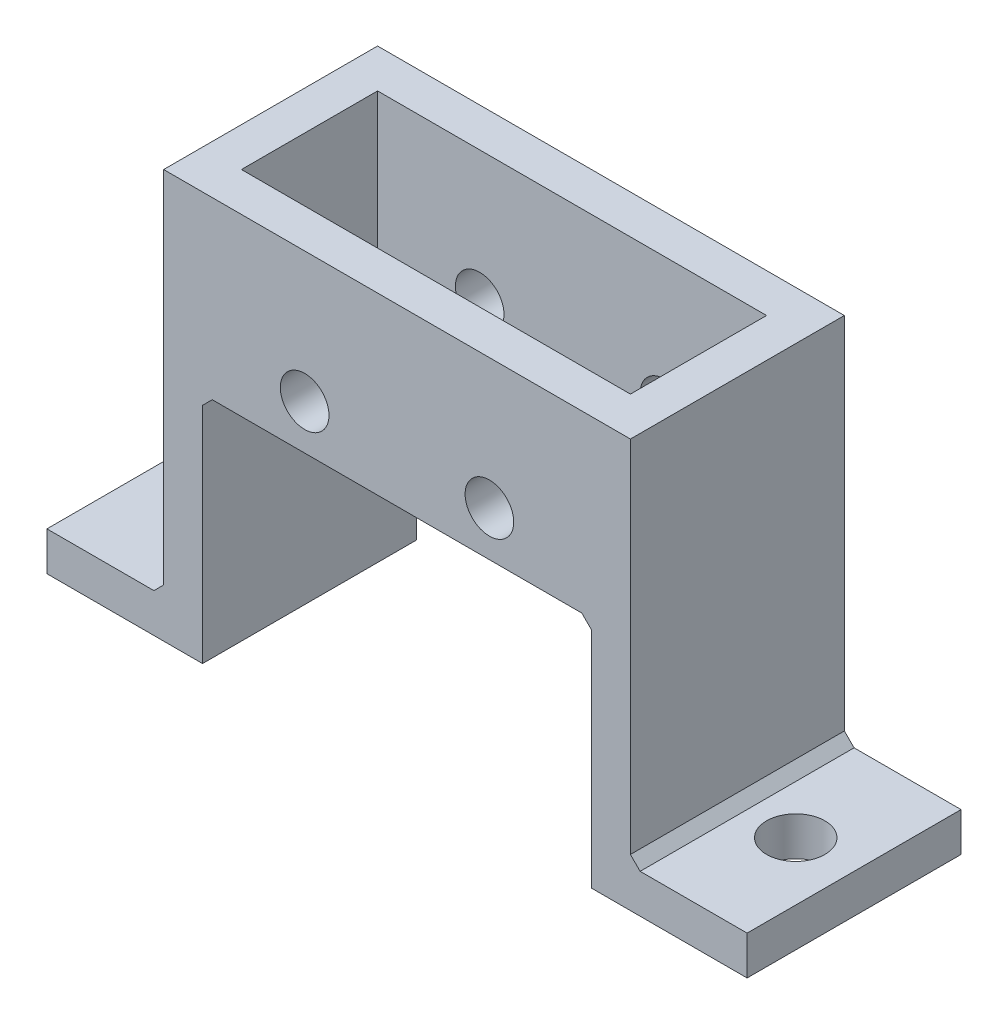
ISO-10303-21;
HEADER;
FILE_DESCRIPTION(('STEP AP214'),'2;1');
FILE_NAME('part.step','',(''),(''),'','','');
FILE_SCHEMA(('AUTOMOTIVE_DESIGN { 1 0 10303 214 1 1 1 1 }'));
ENDSEC;
DATA;
#1=APPLICATION_CONTEXT('core data for automotive mechanical design processes');
#2=APPLICATION_PROTOCOL_DEFINITION('international standard','automotive_design',2000,#1);
#3=PRODUCT_CONTEXT('',#1,'mechanical');
#4=PRODUCT('Part','Part','',(#3));
#5=PRODUCT_RELATED_PRODUCT_CATEGORY('part','',(#4));
#6=PRODUCT_DEFINITION_FORMATION('','',#4);
#7=PRODUCT_DEFINITION_CONTEXT('part definition',#1,'design');
#8=PRODUCT_DEFINITION('design','',#6,#7);
#9=PRODUCT_DEFINITION_SHAPE('','',#8);
#10=(LENGTH_UNIT() NAMED_UNIT(*) SI_UNIT(.MILLI.,.METRE.));
#11=(NAMED_UNIT(*) PLANE_ANGLE_UNIT() SI_UNIT($,.RADIAN.));
#12=(NAMED_UNIT(*) SI_UNIT($,.STERADIAN.) SOLID_ANGLE_UNIT());
#13=UNCERTAINTY_MEASURE_WITH_UNIT(LENGTH_MEASURE(1.E-05),#10,'distance_accuracy_value','');
#14=(GEOMETRIC_REPRESENTATION_CONTEXT(3) GLOBAL_UNCERTAINTY_ASSIGNED_CONTEXT((#13)) GLOBAL_UNIT_ASSIGNED_CONTEXT((#10,
#11,#12)) REPRESENTATION_CONTEXT('',''));
#15=CARTESIAN_POINT('',(0.,0.,0.));
#16=DIRECTION('',(0.,0.,1.));
#17=DIRECTION('',(1.,0.,0.));
#18=AXIS2_PLACEMENT_3D('',#15,#16,#17);
#19=CARTESIAN_POINT('',(20.,10.,-9.));
#20=DIRECTION('',(-1.,0.,0.));
#21=DIRECTION('',(0.,0.,1.));
#22=AXIS2_PLACEMENT_3D('',#19,#20,#21);
#23=PLANE('',#22);
#24=DIRECTION('',(0.,1.,0.));
#25=VECTOR('',#24,1.);
#26=CARTESIAN_POINT('',(20.,-12.,2.));
#27=LINE('',#26,#25);
#28=CARTESIAN_POINT('',(20.,-12.,2.));
#29=VERTEX_POINT('',#28);
#30=CARTESIAN_POINT('',(20.,-0.5,2.));
#31=VERTEX_POINT('',#30);
#32=EDGE_CURVE('E418',#29,#31,#27,.T.);
#33=ORIENTED_EDGE('',*,*,#32,.T.);
#34=DIRECTION('',(0.,0.,-1.));
#35=VECTOR('',#34,1.);
#36=CARTESIAN_POINT('',(20.,-0.5,-9.));
#37=LINE('',#36,#35);
#38=CARTESIAN_POINT('',(20.,-0.5,0.));
#39=VERTEX_POINT('',#38);
#40=EDGE_CURVE('E321',#31,#39,#37,.T.);
#41=ORIENTED_EDGE('',*,*,#40,.T.);
#42=DIRECTION('',(0.,1.,0.));
#43=VECTOR('',#42,1.);
#44=CARTESIAN_POINT('',(20.,0.,0.));
#45=LINE('',#44,#43);
#46=CARTESIAN_POINT('',(20.,9.,0.));
#47=VERTEX_POINT('',#46);
#48=EDGE_CURVE('E237',#39,#47,#45,.T.);
#49=ORIENTED_EDGE('',*,*,#48,.T.);
#50=DIRECTION('',(0.,0.,-1.));
#51=VECTOR('',#50,1.);
#52=CARTESIAN_POINT('',(20.,9.,0.));
#53=LINE('',#52,#51);
#54=CARTESIAN_POINT('',(20.,9.,-7.));
#55=VERTEX_POINT('',#54);
#56=EDGE_CURVE('E222',#47,#55,#53,.T.);
#57=ORIENTED_EDGE('',*,*,#56,.T.);
#58=DIRECTION('',(0.,-1.,0.));
#59=VECTOR('',#58,1.);
#60=CARTESIAN_POINT('',(20.,10.,-7.));
#61=LINE('',#60,#59);
#62=CARTESIAN_POINT('',(20.,-0.5,-7.));
#63=VERTEX_POINT('',#62);
#64=EDGE_CURVE('E234',#55,#63,#61,.T.);
#65=ORIENTED_EDGE('',*,*,#64,.T.);
#66=DIRECTION('',(0.,0.,-1.));
#67=VECTOR('',#66,1.);
#68=CARTESIAN_POINT('',(20.,-0.5,-9.));
#69=LINE('',#68,#67);
#70=CARTESIAN_POINT('',(20.,-0.5,-9.));
#71=VERTEX_POINT('',#70);
#72=EDGE_CURVE('E319',#63,#71,#69,.T.);
#73=ORIENTED_EDGE('',*,*,#72,.T.);
#74=DIRECTION('',(0.,1.,0.));
#75=VECTOR('',#74,1.);
#76=CARTESIAN_POINT('',(20.,-12.,-9.));
#77=LINE('',#76,#75);
#78=CARTESIAN_POINT('',(20.,-12.,-9.));
#79=VERTEX_POINT('',#78);
#80=EDGE_CURVE('E420',#79,#71,#77,.T.);
#81=ORIENTED_EDGE('',*,*,#80,.F.);
#82=DIRECTION('',(0.,0.,-1.));
#83=VECTOR('',#82,1.);
#84=CARTESIAN_POINT('',(20.,-12.,2.));
#85=LINE('',#84,#83);
#86=EDGE_CURVE('E425',#29,#79,#85,.T.);
#87=ORIENTED_EDGE('',*,*,#86,.F.);
#88=EDGE_LOOP('',(#33,#41,#49,#57,#65,#73,#81,#87));
#89=FACE_BOUND('',#88,.T.);
#90=ADVANCED_FACE('F71',(#89),#23,.T.);
#91=CARTESIAN_POINT('',(0.,0.,2.));
#92=DIRECTION('',(0.,0.,1.));
#93=DIRECTION('',(1.,0.,0.));
#94=AXIS2_PLACEMENT_3D('',#91,#92,#93);
#95=PLANE('',#94);
#96=CARTESIAN_POINT('',(5.25,2.3,2.));
#97=DIRECTION('',(0.,0.,1.));
#98=DIRECTION('',(1.,0.,0.));
#99=AXIS2_PLACEMENT_3D('',#96,#97,#98);
#100=CIRCLE('',#99,1.25);
#101=CARTESIAN_POINT('',(6.5,2.3,2.));
#102=VERTEX_POINT('',#101);
#103=EDGE_CURVE('E290',#102,#102,#100,.T.);
#104=ORIENTED_EDGE('',*,*,#103,.F.);
#105=EDGE_LOOP('',(#104));
#106=FACE_BOUND('',#105,.T.);
#107=CARTESIAN_POINT('',(14.75,2.3,2.));
#108=DIRECTION('',(0.,0.,1.));
#109=DIRECTION('',(1.,0.,0.));
#110=AXIS2_PLACEMENT_3D('',#107,#108,#109);
#111=CIRCLE('',#110,1.25);
#112=CARTESIAN_POINT('',(16.,2.3,2.));
#113=VERTEX_POINT('',#112);
#114=EDGE_CURVE('E284',#113,#113,#111,.T.);
#115=ORIENTED_EDGE('',*,*,#114,.F.);
#116=EDGE_LOOP('',(#115));
#117=FACE_BOUND('',#116,.T.);
#118=DIRECTION('',(-1.,0.,0.));
#119=VECTOR('',#118,1.);
#120=CARTESIAN_POINT('',(28.,-10.,2.));
#121=LINE('',#120,#119);
#122=CARTESIAN_POINT('',(28.,-10.,2.));
#123=VERTEX_POINT('',#122);
#124=CARTESIAN_POINT('',(22.5,-10.,2.));
#125=VERTEX_POINT('',#124);
#126=EDGE_CURVE('E413',#123,#125,#121,.T.);
#127=ORIENTED_EDGE('',*,*,#126,.T.);
#128=DIRECTION('',(-0.707106781186555,0.70710678118654,0.));
#129=VECTOR('',#128,1.);
#130=CARTESIAN_POINT('',(22.5,-10.,2.));
#131=LINE('',#130,#129);
#132=CARTESIAN_POINT('',(22.,-9.5,2.));
#133=VERTEX_POINT('',#132);
#134=EDGE_CURVE('E80',#125,#133,#131,.T.);
#135=ORIENTED_EDGE('',*,*,#134,.T.);
#136=DIRECTION('',(0.,1.,0.));
#137=VECTOR('',#136,1.);
#138=CARTESIAN_POINT('',(22.,10.,2.));
#139=LINE('',#138,#137);
#140=CARTESIAN_POINT('',(22.,9.,2.));
#141=VERTEX_POINT('',#140);
#142=EDGE_CURVE('E278',#133,#141,#139,.T.);
#143=ORIENTED_EDGE('',*,*,#142,.T.);
#144=DIRECTION('',(1.,0.,0.));
#145=VECTOR('',#144,1.);
#146=CARTESIAN_POINT('',(-2.,9.,2.));
#147=LINE('',#146,#145);
#148=CARTESIAN_POINT('',(-2.,9.,2.));
#149=VERTEX_POINT('',#148);
#150=EDGE_CURVE('E382',#149,#141,#147,.T.);
#151=ORIENTED_EDGE('',*,*,#150,.F.);
#152=DIRECTION('',(0.,-1.,0.));
#153=VECTOR('',#152,1.);
#154=CARTESIAN_POINT('',(-2.,10.,2.));
#155=LINE('',#154,#153);
#156=CARTESIAN_POINT('',(-2.,-9.49999999999999,2.));
#157=VERTEX_POINT('',#156);
#158=EDGE_CURVE('E272',#149,#157,#155,.T.);
#159=ORIENTED_EDGE('',*,*,#158,.T.);
#160=DIRECTION('',(-0.707106781186548,-0.707106781186548,0.));
#161=VECTOR('',#160,1.);
#162=CARTESIAN_POINT('',(-2.5,-10.,2.));
#163=LINE('',#162,#161);
#164=CARTESIAN_POINT('',(-2.5,-10.,2.));
#165=VERTEX_POINT('',#164);
#166=EDGE_CURVE('E350',#157,#165,#163,.T.);
#167=ORIENTED_EDGE('',*,*,#166,.T.);
#168=DIRECTION('',(1.,0.,0.));
#169=VECTOR('',#168,1.);
#170=CARTESIAN_POINT('',(-8.,-10.,2.));
#171=LINE('',#170,#169);
#172=CARTESIAN_POINT('',(-8.,-10.,2.));
#173=VERTEX_POINT('',#172);
#174=EDGE_CURVE('E356',#173,#165,#171,.T.);
#175=ORIENTED_EDGE('',*,*,#174,.F.);
#176=DIRECTION('',(0.,1.,0.));
#177=VECTOR('',#176,1.);
#178=CARTESIAN_POINT('',(-8.,-12.,2.));
#179=LINE('',#178,#177);
#180=CARTESIAN_POINT('',(-8.,-12.,2.));
#181=VERTEX_POINT('',#180);
#182=EDGE_CURVE('E400',#181,#173,#179,.T.);
#183=ORIENTED_EDGE('',*,*,#182,.F.);
#184=DIRECTION('',(-1.,0.,0.));
#185=VECTOR('',#184,1.);
#186=CARTESIAN_POINT('',(-2.,-12.,2.));
#187=LINE('',#186,#185);
#188=CARTESIAN_POINT('',(0.,-12.,2.));
#189=VERTEX_POINT('',#188);
#190=EDGE_CURVE('E262',#189,#181,#187,.T.);
#191=ORIENTED_EDGE('',*,*,#190,.F.);
#192=DIRECTION('',(0.,1.,0.));
#193=VECTOR('',#192,1.);
#194=CARTESIAN_POINT('',(0.,-12.,2.));
#195=LINE('',#194,#193);
#196=CARTESIAN_POINT('',(0.,-0.5,2.));
#197=VERTEX_POINT('',#196);
#198=EDGE_CURVE('E264',#189,#197,#195,.T.);
#199=ORIENTED_EDGE('',*,*,#198,.T.);
#200=DIRECTION('',(0.707106781186545,0.70710678118655,0.));
#201=VECTOR('',#200,1.);
#202=CARTESIAN_POINT('',(0.,-0.5,2.));
#203=LINE('',#202,#201);
#204=CARTESIAN_POINT('',(0.499999999999997,0.,2.));
#205=VERTEX_POINT('',#204);
#206=EDGE_CURVE('E336',#197,#205,#203,.T.);
#207=ORIENTED_EDGE('',*,*,#206,.T.);
#208=DIRECTION('',(1.,0.,0.));
#209=VECTOR('',#208,1.);
#210=CARTESIAN_POINT('',(0.,0.,2.));
#211=LINE('',#210,#209);
#212=CARTESIAN_POINT('',(19.5,0.,2.));
#213=VERTEX_POINT('',#212);
#214=EDGE_CURVE('E296',#205,#213,#211,.T.);
#215=ORIENTED_EDGE('',*,*,#214,.T.);
#216=DIRECTION('',(0.707106781186545,-0.70710678118655,0.));
#217=VECTOR('',#216,1.);
#218=CARTESIAN_POINT('',(20.,-0.5,2.));
#219=LINE('',#218,#217);
#220=EDGE_CURVE('E343',#213,#31,#219,.T.);
#221=ORIENTED_EDGE('',*,*,#220,.T.);
#222=ORIENTED_EDGE('',*,*,#32,.F.);
#223=DIRECTION('',(-1.,0.,0.));
#224=VECTOR('',#223,1.);
#225=CARTESIAN_POINT('',(22.,-12.,2.));
#226=LINE('',#225,#224);
#227=CARTESIAN_POINT('',(28.,-12.,2.));
#228=VERTEX_POINT('',#227);
#229=EDGE_CURVE('E427',#228,#29,#226,.T.);
#230=ORIENTED_EDGE('',*,*,#229,.F.);
#231=DIRECTION('',(0.,-1.,0.));
#232=VECTOR('',#231,1.);
#233=CARTESIAN_POINT('',(28.,-12.,2.));
#234=LINE('',#233,#232);
#235=EDGE_CURVE('E368',#123,#228,#234,.T.);
#236=ORIENTED_EDGE('',*,*,#235,.F.);
#237=EDGE_LOOP('',(#127,#135,#143,#151,#159,#167,#175,#183,#191,#199,#207,#215,#221,#222,#230,#236));
#238=FACE_BOUND('',#237,.T.);
#239=ADVANCED_FACE('F354',(#106,#117,#238),#95,.T.);
#240=CARTESIAN_POINT('',(0.,0.,0.));
#241=DIRECTION('',(0.,0.,1.));
#242=DIRECTION('',(1.,0.,0.));
#243=AXIS2_PLACEMENT_3D('',#240,#241,#242);
#244=PLANE('',#243);
#245=CARTESIAN_POINT('',(14.75,2.3,0.));
#246=DIRECTION('',(0.,0.,1.));
#247=DIRECTION('',(1.,0.,0.));
#248=AXIS2_PLACEMENT_3D('',#245,#246,#247);
#249=CIRCLE('',#248,1.25);
#250=CARTESIAN_POINT('',(16.,2.3,0.));
#251=VERTEX_POINT('',#250);
#252=EDGE_CURVE('E275',#251,#251,#249,.T.);
#253=ORIENTED_EDGE('',*,*,#252,.T.);
#254=EDGE_LOOP('',(#253));
#255=FACE_BOUND('',#254,.T.);
#256=CARTESIAN_POINT('',(5.25,2.3,0.));
#257=DIRECTION('',(0.,0.,1.));
#258=DIRECTION('',(1.,0.,0.));
#259=AXIS2_PLACEMENT_3D('',#256,#257,#258);
#260=CIRCLE('',#259,1.25);
#261=CARTESIAN_POINT('',(6.5,2.3,0.));
#262=VERTEX_POINT('',#261);
#263=EDGE_CURVE('E287',#262,#262,#260,.T.);
#264=ORIENTED_EDGE('',*,*,#263,.T.);
#265=EDGE_LOOP('',(#264));
#266=FACE_BOUND('',#265,.T.);
#267=DIRECTION('',(1.,0.,0.));
#268=VECTOR('',#267,1.);
#269=CARTESIAN_POINT('',(20.,9.,0.));
#270=LINE('',#269,#268);
#271=CARTESIAN_POINT('',(0.,9.,0.));
#272=VERTEX_POINT('',#271);
#273=EDGE_CURVE('E383',#272,#47,#270,.T.);
#274=ORIENTED_EDGE('',*,*,#273,.T.);
#275=ORIENTED_EDGE('',*,*,#48,.F.);
#276=DIRECTION('',(-0.707106781186545,0.70710678118655,0.));
#277=VECTOR('',#276,1.);
#278=CARTESIAN_POINT('',(9.75000000000007,9.75,0.));
#279=LINE('',#278,#277);
#280=CARTESIAN_POINT('',(19.5,0.,0.));
#281=VERTEX_POINT('',#280);
#282=EDGE_CURVE('E341',#39,#281,#279,.T.);
#283=ORIENTED_EDGE('',*,*,#282,.T.);
#284=DIRECTION('',(1.,0.,0.));
#285=VECTOR('',#284,1.);
#286=CARTESIAN_POINT('',(0.,0.,0.));
#287=LINE('',#286,#285);
#288=CARTESIAN_POINT('',(0.499999999999997,0.,0.));
#289=VERTEX_POINT('',#288);
#290=EDGE_CURVE('E301',#289,#281,#287,.T.);
#291=ORIENTED_EDGE('',*,*,#290,.F.);
#292=DIRECTION('',(-0.707106781186545,-0.70710678118655,0.));
#293=VECTOR('',#292,1.);
#294=CARTESIAN_POINT('',(0.25,-0.249999999999999,0.));
#295=LINE('',#294,#293);
#296=CARTESIAN_POINT('',(0.,-0.5,0.));
#297=VERTEX_POINT('',#296);
#298=EDGE_CURVE('E338',#289,#297,#295,.T.);
#299=ORIENTED_EDGE('',*,*,#298,.T.);
#300=DIRECTION('',(0.,-1.,0.));
#301=VECTOR('',#300,1.);
#302=CARTESIAN_POINT('',(0.,10.,0.));
#303=LINE('',#302,#301);
#304=EDGE_CURVE('E293',#272,#297,#303,.T.);
#305=ORIENTED_EDGE('',*,*,#304,.F.);
#306=EDGE_LOOP('',(#274,#275,#283,#291,#299,#305));
#307=FACE_BOUND('',#306,.T.);
#308=ADVANCED_FACE('F458',(#255,#266,#307),#244,.F.);
#309=CARTESIAN_POINT('',(22.,10.,-9.));
#310=DIRECTION('',(1.,0.,0.));
#311=DIRECTION('',(0.,0.,-1.));
#312=AXIS2_PLACEMENT_3D('',#309,#310,#311);
#313=PLANE('',#312);
#314=ORIENTED_EDGE('',*,*,#142,.F.);
#315=DIRECTION('',(0.,0.,-1.));
#316=VECTOR('',#315,1.);
#317=CARTESIAN_POINT('',(22.,-9.5,-9.));
#318=LINE('',#317,#316);
#319=CARTESIAN_POINT('',(22.,-9.5,-9.));
#320=VERTEX_POINT('',#319);
#321=EDGE_CURVE('E93',#133,#320,#318,.T.);
#322=ORIENTED_EDGE('',*,*,#321,.T.);
#323=DIRECTION('',(0.,1.,0.));
#324=VECTOR('',#323,1.);
#325=CARTESIAN_POINT('',(22.,10.,-9.));
#326=LINE('',#325,#324);
#327=CARTESIAN_POINT('',(22.,9.,-9.));
#328=VERTEX_POINT('',#327);
#329=EDGE_CURVE('E267',#320,#328,#326,.T.);
#330=ORIENTED_EDGE('',*,*,#329,.T.);
#331=DIRECTION('',(0.,0.,-1.));
#332=VECTOR('',#331,1.);
#333=CARTESIAN_POINT('',(22.,9.,-9.));
#334=LINE('',#333,#332);
#335=EDGE_CURVE('E385',#141,#328,#334,.T.);
#336=ORIENTED_EDGE('',*,*,#335,.F.);
#337=EDGE_LOOP('',(#314,#322,#330,#336));
#338=FACE_BOUND('',#337,.T.);
#339=ADVANCED_FACE('F463',(#338),#313,.T.);
#340=CARTESIAN_POINT('',(0.,10.,-9.));
#341=DIRECTION('',(1.,0.,0.));
#342=DIRECTION('',(0.,0.,-1.));
#343=AXIS2_PLACEMENT_3D('',#340,#341,#342);
#344=PLANE('',#343);
#345=DIRECTION('',(0.,1.,0.));
#346=VECTOR('',#345,1.);
#347=CARTESIAN_POINT('',(0.,10.,-9.));
#348=LINE('',#347,#346);
#349=CARTESIAN_POINT('',(0.,-12.,-9.));
#350=VERTEX_POINT('',#349);
#351=CARTESIAN_POINT('',(0.,-0.499999999999997,-9.));
#352=VERTEX_POINT('',#351);
#353=EDGE_CURVE('E268',#350,#352,#348,.T.);
#354=ORIENTED_EDGE('',*,*,#353,.T.);
#355=DIRECTION('',(0.,0.,1.));
#356=VECTOR('',#355,1.);
#357=CARTESIAN_POINT('',(0.,-0.499999999999997,-9.));
#358=LINE('',#357,#356);
#359=CARTESIAN_POINT('',(0.,-0.499999999999997,-7.));
#360=VERTEX_POINT('',#359);
#361=EDGE_CURVE('E312',#352,#360,#358,.T.);
#362=ORIENTED_EDGE('',*,*,#361,.T.);
#363=DIRECTION('',(0.,1.,0.));
#364=VECTOR('',#363,1.);
#365=CARTESIAN_POINT('',(0.,10.,-7.));
#366=LINE('',#365,#364);
#367=CARTESIAN_POINT('',(0.,9.,-7.));
#368=VERTEX_POINT('',#367);
#369=EDGE_CURVE('E249',#360,#368,#366,.T.);
#370=ORIENTED_EDGE('',*,*,#369,.T.);
#371=DIRECTION('',(0.,0.,1.));
#372=VECTOR('',#371,1.);
#373=CARTESIAN_POINT('',(0.,9.,0.));
#374=LINE('',#373,#372);
#375=EDGE_CURVE('E225',#368,#272,#374,.T.);
#376=ORIENTED_EDGE('',*,*,#375,.T.);
#377=ORIENTED_EDGE('',*,*,#304,.T.);
#378=DIRECTION('',(0.,0.,1.));
#379=VECTOR('',#378,1.);
#380=CARTESIAN_POINT('',(0.,-0.5,-9.));
#381=LINE('',#380,#379);
#382=EDGE_CURVE('E309',#297,#197,#381,.T.);
#383=ORIENTED_EDGE('',*,*,#382,.T.);
#384=ORIENTED_EDGE('',*,*,#198,.F.);
#385=DIRECTION('',(0.,0.,1.));
#386=VECTOR('',#385,1.);
#387=CARTESIAN_POINT('',(0.,-12.,2.));
#388=LINE('',#387,#386);
#389=EDGE_CURVE('E260',#350,#189,#388,.T.);
#390=ORIENTED_EDGE('',*,*,#389,.F.);
#391=EDGE_LOOP('',(#354,#362,#370,#376,#377,#383,#384,#390));
#392=FACE_BOUND('',#391,.T.);
#393=ADVANCED_FACE('F448',(#392),#344,.T.);
#394=CARTESIAN_POINT('',(-2.,10.,-9.));
#395=DIRECTION('',(-1.,0.,0.));
#396=DIRECTION('',(0.,-1.,0.));
#397=AXIS2_PLACEMENT_3D('',#394,#395,#396);
#398=PLANE('',#397);
#399=DIRECTION('',(0.,-1.,0.));
#400=VECTOR('',#399,1.);
#401=CARTESIAN_POINT('',(-2.,10.,-9.));
#402=LINE('',#401,#400);
#403=CARTESIAN_POINT('',(-2.,9.,-9.));
#404=VERTEX_POINT('',#403);
#405=CARTESIAN_POINT('',(-2.,-9.49999999999999,-9.));
#406=VERTEX_POINT('',#405);
#407=EDGE_CURVE('E271',#404,#406,#402,.T.);
#408=ORIENTED_EDGE('',*,*,#407,.T.);
#409=DIRECTION('',(0.,0.,1.));
#410=VECTOR('',#409,1.);
#411=CARTESIAN_POINT('',(-2.,-9.49999999999999,-9.));
#412=LINE('',#411,#410);
#413=EDGE_CURVE('E326',#406,#157,#412,.T.);
#414=ORIENTED_EDGE('',*,*,#413,.T.);
#415=ORIENTED_EDGE('',*,*,#158,.F.);
#416=DIRECTION('',(0.,0.,1.));
#417=VECTOR('',#416,1.);
#418=CARTESIAN_POINT('',(-2.,9.,-9.));
#419=LINE('',#418,#417);
#420=EDGE_CURVE('E380',#404,#149,#419,.T.);
#421=ORIENTED_EDGE('',*,*,#420,.F.);
#422=EDGE_LOOP('',(#408,#414,#415,#421));
#423=FACE_BOUND('',#422,.T.);
#424=ADVANCED_FACE('F379',(#423),#398,.T.);
#425=CARTESIAN_POINT('',(0.,0.,-9.));
#426=DIRECTION('',(0.,0.,1.));
#427=DIRECTION('',(1.,0.,0.));
#428=AXIS2_PLACEMENT_3D('',#425,#426,#427);
#429=PLANE('',#428);
#430=CARTESIAN_POINT('',(5.25,2.3,-9.));
#431=DIRECTION('',(0.,0.,-1.));
#432=DIRECTION('',(-1.,0.,0.));
#433=AXIS2_PLACEMENT_3D('',#430,#431,#432);
#434=CIRCLE('',#433,1.25);
#435=CARTESIAN_POINT('',(4.,2.3,-9.));
#436=VERTEX_POINT('',#435);
#437=EDGE_CURVE('E252',#436,#436,#434,.T.);
#438=ORIENTED_EDGE('',*,*,#437,.F.);
#439=EDGE_LOOP('',(#438));
#440=FACE_BOUND('',#439,.T.);
#441=CARTESIAN_POINT('',(14.75,2.3,-9.));
#442=DIRECTION('',(0.,0.,-1.));
#443=DIRECTION('',(-1.,0.,0.));
#444=AXIS2_PLACEMENT_3D('',#441,#442,#443);
#445=CIRCLE('',#444,1.25);
#446=CARTESIAN_POINT('',(13.5,2.3,-9.));
#447=VERTEX_POINT('',#446);
#448=EDGE_CURVE('E429',#447,#447,#445,.T.);
#449=ORIENTED_EDGE('',*,*,#448,.F.);
#450=EDGE_LOOP('',(#449));
#451=FACE_BOUND('',#450,.T.);
#452=DIRECTION('',(-1.,0.,0.));
#453=VECTOR('',#452,1.);
#454=CARTESIAN_POINT('',(-2.,9.,-9.));
#455=LINE('',#454,#453);
#456=EDGE_CURVE('E392',#328,#404,#455,.T.);
#457=ORIENTED_EDGE('',*,*,#456,.F.);
#458=ORIENTED_EDGE('',*,*,#329,.F.);
#459=DIRECTION('',(0.707106781186555,-0.70710678118654,0.));
#460=VECTOR('',#459,1.);
#461=CARTESIAN_POINT('',(6.24999999999977,6.2499999999999,-9.));
#462=LINE('',#461,#460);
#463=CARTESIAN_POINT('',(22.5,-10.,-9.));
#464=VERTEX_POINT('',#463);
#465=EDGE_CURVE('E12',#320,#464,#462,.T.);
#466=ORIENTED_EDGE('',*,*,#465,.T.);
#467=DIRECTION('',(-1.,0.,0.));
#468=VECTOR('',#467,1.);
#469=CARTESIAN_POINT('',(28.,-10.,-9.));
#470=LINE('',#469,#468);
#471=CARTESIAN_POINT('',(28.,-10.,-9.));
#472=VERTEX_POINT('',#471);
#473=EDGE_CURVE('E415',#472,#464,#470,.T.);
#474=ORIENTED_EDGE('',*,*,#473,.F.);
#475=DIRECTION('',(0.,1.,0.));
#476=VECTOR('',#475,1.);
#477=CARTESIAN_POINT('',(28.,-12.,-9.));
#478=LINE('',#477,#476);
#479=CARTESIAN_POINT('',(28.,-12.,-9.));
#480=VERTEX_POINT('',#479);
#481=EDGE_CURVE('E409',#480,#472,#478,.T.);
#482=ORIENTED_EDGE('',*,*,#481,.F.);
#483=DIRECTION('',(1.,0.,0.));
#484=VECTOR('',#483,1.);
#485=CARTESIAN_POINT('',(22.,-12.,-9.));
#486=LINE('',#485,#484);
#487=EDGE_CURVE('E423',#79,#480,#486,.T.);
#488=ORIENTED_EDGE('',*,*,#487,.F.);
#489=ORIENTED_EDGE('',*,*,#80,.T.);
#490=DIRECTION('',(-0.707106781186545,0.70710678118655,0.));
#491=VECTOR('',#490,1.);
#492=CARTESIAN_POINT('',(9.75000000000007,9.75,-9.));
#493=LINE('',#492,#491);
#494=CARTESIAN_POINT('',(19.5,0.,-9.));
#495=VERTEX_POINT('',#494);
#496=EDGE_CURVE('E345',#71,#495,#493,.T.);
#497=ORIENTED_EDGE('',*,*,#496,.T.);
#498=DIRECTION('',(1.,0.,0.));
#499=VECTOR('',#498,1.);
#500=CARTESIAN_POINT('',(22.,0.,-9.));
#501=LINE('',#500,#499);
#502=CARTESIAN_POINT('',(0.5,0.,-9.));
#503=VERTEX_POINT('',#502);
#504=EDGE_CURVE('E280',#503,#495,#501,.T.);
#505=ORIENTED_EDGE('',*,*,#504,.F.);
#506=DIRECTION('',(-0.70710678118655,-0.707106781186545,0.));
#507=VECTOR('',#506,1.);
#508=CARTESIAN_POINT('',(0.249999999999999,-0.25,-9.));
#509=LINE('',#508,#507);
#510=EDGE_CURVE('E332',#503,#352,#509,.T.);
#511=ORIENTED_EDGE('',*,*,#510,.T.);
#512=ORIENTED_EDGE('',*,*,#353,.F.);
#513=DIRECTION('',(1.,0.,0.));
#514=VECTOR('',#513,1.);
#515=CARTESIAN_POINT('',(-2.,-12.,-9.));
#516=LINE('',#515,#514);
#517=CARTESIAN_POINT('',(-8.,-12.,-9.));
#518=VERTEX_POINT('',#517);
#519=EDGE_CURVE('E257',#518,#350,#516,.T.);
#520=ORIENTED_EDGE('',*,*,#519,.F.);
#521=DIRECTION('',(0.,-1.,0.));
#522=VECTOR('',#521,1.);
#523=CARTESIAN_POINT('',(-8.,-12.,-9.));
#524=LINE('',#523,#522);
#525=CARTESIAN_POINT('',(-8.,-10.,-9.));
#526=VERTEX_POINT('',#525);
#527=EDGE_CURVE('E394',#526,#518,#524,.T.);
#528=ORIENTED_EDGE('',*,*,#527,.F.);
#529=DIRECTION('',(1.,0.,0.));
#530=VECTOR('',#529,1.);
#531=CARTESIAN_POINT('',(-8.,-10.,-9.));
#532=LINE('',#531,#530);
#533=CARTESIAN_POINT('',(-2.5,-10.,-9.));
#534=VERTEX_POINT('',#533);
#535=EDGE_CURVE('E369',#526,#534,#532,.T.);
#536=ORIENTED_EDGE('',*,*,#535,.T.);
#537=DIRECTION('',(0.707106781186548,0.707106781186548,0.));
#538=VECTOR('',#537,1.);
#539=CARTESIAN_POINT('',(3.75,-3.75,-9.));
#540=LINE('',#539,#538);
#541=EDGE_CURVE('E348',#534,#406,#540,.T.);
#542=ORIENTED_EDGE('',*,*,#541,.T.);
#543=ORIENTED_EDGE('',*,*,#407,.F.);
#544=EDGE_LOOP('',(#457,#458,#466,#474,#482,#488,#489,#497,#505,#511,#512,#520,#528,#536,#542,#543));
#545=FACE_BOUND('',#544,.T.);
#546=ADVANCED_FACE('F375',(#440,#451,#545),#429,.F.);
#547=CARTESIAN_POINT('',(0.,0.,-7.));
#548=DIRECTION('',(0.,0.,-1.));
#549=DIRECTION('',(-1.,0.,0.));
#550=AXIS2_PLACEMENT_3D('',#547,#548,#549);
#551=PLANE('',#550);
#552=CARTESIAN_POINT('',(5.25,2.3,-7.));
#553=DIRECTION('',(0.,0.,-1.));
#554=DIRECTION('',(-1.,0.,0.));
#555=AXIS2_PLACEMENT_3D('',#552,#553,#554);
#556=CIRCLE('',#555,1.25);
#557=CARTESIAN_POINT('',(4.,2.3,-7.));
#558=VERTEX_POINT('',#557);
#559=EDGE_CURVE('E246',#558,#558,#556,.T.);
#560=ORIENTED_EDGE('',*,*,#559,.T.);
#561=EDGE_LOOP('',(#560));
#562=FACE_BOUND('',#561,.T.);
#563=CARTESIAN_POINT('',(14.75,2.3,-7.));
#564=DIRECTION('',(0.,0.,-1.));
#565=DIRECTION('',(-1.,0.,0.));
#566=AXIS2_PLACEMENT_3D('',#563,#564,#565);
#567=CIRCLE('',#566,1.25);
#568=CARTESIAN_POINT('',(13.5,2.3,-7.));
#569=VERTEX_POINT('',#568);
#570=EDGE_CURVE('E430',#569,#569,#567,.T.);
#571=ORIENTED_EDGE('',*,*,#570,.T.);
#572=EDGE_LOOP('',(#571));
#573=FACE_BOUND('',#572,.T.);
#574=DIRECTION('',(-1.,0.,0.));
#575=VECTOR('',#574,1.);
#576=CARTESIAN_POINT('',(20.,9.,-7.));
#577=LINE('',#576,#575);
#578=EDGE_CURVE('E218',#55,#368,#577,.T.);
#579=ORIENTED_EDGE('',*,*,#578,.T.);
#580=ORIENTED_EDGE('',*,*,#369,.F.);
#581=DIRECTION('',(0.70710678118655,0.707106781186545,0.));
#582=VECTOR('',#581,1.);
#583=CARTESIAN_POINT('',(0.249999999999999,-0.25,-7.));
#584=LINE('',#583,#582);
#585=CARTESIAN_POINT('',(0.5,0.,-7.));
#586=VERTEX_POINT('',#585);
#587=EDGE_CURVE('E334',#360,#586,#584,.T.);
#588=ORIENTED_EDGE('',*,*,#587,.T.);
#589=DIRECTION('',(-1.,0.,0.));
#590=VECTOR('',#589,1.);
#591=CARTESIAN_POINT('',(20.,0.,-7.));
#592=LINE('',#591,#590);
#593=CARTESIAN_POINT('',(19.5,0.,-7.));
#594=VERTEX_POINT('',#593);
#595=EDGE_CURVE('E245',#594,#586,#592,.T.);
#596=ORIENTED_EDGE('',*,*,#595,.F.);
#597=DIRECTION('',(0.707106781186545,-0.70710678118655,0.));
#598=VECTOR('',#597,1.);
#599=CARTESIAN_POINT('',(9.75000000000007,9.75,-7.));
#600=LINE('',#599,#598);
#601=EDGE_CURVE('E243',#594,#63,#600,.T.);
#602=ORIENTED_EDGE('',*,*,#601,.T.);
#603=ORIENTED_EDGE('',*,*,#64,.F.);
#604=EDGE_LOOP('',(#579,#580,#588,#596,#602,#603));
#605=FACE_BOUND('',#604,.T.);
#606=ADVANCED_FACE('F240',(#562,#573,#605),#551,.F.);
#607=CARTESIAN_POINT('',(0.,0.,2.));
#608=DIRECTION('',(0.,1.,0.));
#609=DIRECTION('',(0.,0.,1.));
#610=AXIS2_PLACEMENT_3D('',#607,#608,#609);
#611=PLANE('',#610);
#612=ORIENTED_EDGE('',*,*,#214,.F.);
#613=DIRECTION('',(0.,0.,-1.));
#614=VECTOR('',#613,1.);
#615=CARTESIAN_POINT('',(0.499999999999997,0.,2.));
#616=LINE('',#615,#614);
#617=EDGE_CURVE('E317',#205,#289,#616,.T.);
#618=ORIENTED_EDGE('',*,*,#617,.T.);
#619=ORIENTED_EDGE('',*,*,#290,.T.);
#620=DIRECTION('',(0.,0.,1.));
#621=VECTOR('',#620,1.);
#622=CARTESIAN_POINT('',(19.5,0.,2.));
#623=LINE('',#622,#621);
#624=EDGE_CURVE('E315',#281,#213,#623,.T.);
#625=ORIENTED_EDGE('',*,*,#624,.T.);
#626=EDGE_LOOP('',(#612,#618,#619,#625));
#627=FACE_BOUND('',#626,.T.);
#628=ADVANCED_FACE('F445',(#627),#611,.F.);
#629=ORIENTED_EDGE('',*,*,#595,.T.);
#630=DIRECTION('',(0.,0.,-1.));
#631=VECTOR('',#630,1.);
#632=CARTESIAN_POINT('',(0.5,0.,2.));
#633=LINE('',#632,#631);
#634=EDGE_CURVE('E306',#586,#503,#633,.T.);
#635=ORIENTED_EDGE('',*,*,#634,.T.);
#636=ORIENTED_EDGE('',*,*,#504,.T.);
#637=DIRECTION('',(0.,0.,1.));
#638=VECTOR('',#637,1.);
#639=CARTESIAN_POINT('',(19.5,0.,2.));
#640=LINE('',#639,#638);
#641=EDGE_CURVE('E299',#495,#594,#640,.T.);
#642=ORIENTED_EDGE('',*,*,#641,.T.);
#643=EDGE_LOOP('',(#629,#635,#636,#642));
#644=FACE_BOUND('',#643,.T.);
#645=ADVANCED_FACE('F473',(#644),#611,.F.);
#646=CARTESIAN_POINT('',(5.25,2.3,2.));
#647=DIRECTION('',(0.,0.,-1.));
#648=DIRECTION('',(-1.,0.,0.));
#649=AXIS2_PLACEMENT_3D('',#646,#647,#648);
#650=CYLINDRICAL_SURFACE('',#649,1.25);
#651=ORIENTED_EDGE('',*,*,#103,.T.);
#652=EDGE_LOOP('',(#651));
#653=FACE_BOUND('',#652,.T.);
#654=ORIENTED_EDGE('',*,*,#263,.F.);
#655=EDGE_LOOP('',(#654));
#656=FACE_BOUND('',#655,.T.);
#657=ADVANCED_FACE('F470',(#653,#656),#650,.F.);
#658=CARTESIAN_POINT('',(14.75,2.3,2.));
#659=DIRECTION('',(0.,0.,-1.));
#660=DIRECTION('',(-1.,0.,0.));
#661=AXIS2_PLACEMENT_3D('',#658,#659,#660);
#662=CYLINDRICAL_SURFACE('',#661,1.25);
#663=ORIENTED_EDGE('',*,*,#114,.T.);
#664=EDGE_LOOP('',(#663));
#665=FACE_BOUND('',#664,.T.);
#666=ORIENTED_EDGE('',*,*,#252,.F.);
#667=EDGE_LOOP('',(#666));
#668=FACE_BOUND('',#667,.T.);
#669=ADVANCED_FACE('F466',(#665,#668),#662,.F.);
#670=CARTESIAN_POINT('',(0.,-12.,0.));
#671=DIRECTION('',(0.,-1.,0.));
#672=DIRECTION('',(0.,0.,-1.));
#673=AXIS2_PLACEMENT_3D('',#670,#671,#672);
#674=PLANE('',#673);
#675=CARTESIAN_POINT('',(-5.,-12.,-3.5));
#676=DIRECTION('',(0.,-1.,0.));
#677=DIRECTION('',(0.,0.,-1.));
#678=AXIS2_PLACEMENT_3D('',#675,#676,#677);
#679=CIRCLE('',#678,1.5);
#680=CARTESIAN_POINT('',(-5.,-12.,-5.));
#681=VERTEX_POINT('',#680);
#682=EDGE_CURVE('E566',#681,#681,#679,.T.);
#683=ORIENTED_EDGE('',*,*,#682,.F.);
#684=EDGE_LOOP('',(#683));
#685=FACE_BOUND('',#684,.T.);
#686=ORIENTED_EDGE('',*,*,#190,.T.);
#687=DIRECTION('',(0.,0.,1.));
#688=VECTOR('',#687,1.);
#689=CARTESIAN_POINT('',(-8.,-12.,-9.));
#690=LINE('',#689,#688);
#691=EDGE_CURVE('E397',#518,#181,#690,.T.);
#692=ORIENTED_EDGE('',*,*,#691,.F.);
#693=ORIENTED_EDGE('',*,*,#519,.T.);
#694=ORIENTED_EDGE('',*,*,#389,.T.);
#695=EDGE_LOOP('',(#686,#692,#693,#694));
#696=FACE_BOUND('',#695,.T.);
#697=ADVANCED_FACE('F469',(#685,#696),#674,.T.);
#698=CARTESIAN_POINT('',(5.25,2.3,-7.));
#699=DIRECTION('',(0.,0.,-1.));
#700=DIRECTION('',(-1.,0.,0.));
#701=AXIS2_PLACEMENT_3D('',#698,#699,#700);
#702=CYLINDRICAL_SURFACE('',#701,1.25);
#703=ORIENTED_EDGE('',*,*,#559,.F.);
#704=EDGE_LOOP('',(#703));
#705=FACE_BOUND('',#704,.T.);
#706=ORIENTED_EDGE('',*,*,#437,.T.);
#707=EDGE_LOOP('',(#706));
#708=FACE_BOUND('',#707,.T.);
#709=ADVANCED_FACE('F596',(#705,#708),#702,.F.);
#710=CARTESIAN_POINT('',(14.75,2.3,-7.));
#711=DIRECTION('',(0.,0.,-1.));
#712=DIRECTION('',(-1.,0.,0.));
#713=AXIS2_PLACEMENT_3D('',#710,#711,#712);
#714=CYLINDRICAL_SURFACE('',#713,1.25);
#715=ORIENTED_EDGE('',*,*,#570,.F.);
#716=EDGE_LOOP('',(#715));
#717=FACE_BOUND('',#716,.T.);
#718=ORIENTED_EDGE('',*,*,#448,.T.);
#719=EDGE_LOOP('',(#718));
#720=FACE_BOUND('',#719,.T.);
#721=ADVANCED_FACE('F436',(#717,#720),#714,.F.);
#722=CARTESIAN_POINT('',(0.,-12.,0.));
#723=DIRECTION('',(0.,1.,0.));
#724=DIRECTION('',(0.,0.,1.));
#725=AXIS2_PLACEMENT_3D('',#722,#723,#724);
#726=PLANE('',#725);
#727=CARTESIAN_POINT('',(25.,-12.,-3.5));
#728=DIRECTION('',(0.,1.,0.));
#729=DIRECTION('',(0.,0.,1.));
#730=AXIS2_PLACEMENT_3D('',#727,#728,#729);
#731=CIRCLE('',#730,1.5);
#732=CARTESIAN_POINT('',(25.,-12.,-2.));
#733=VERTEX_POINT('',#732);
#734=EDGE_CURVE('E238',#733,#733,#731,.T.);
#735=ORIENTED_EDGE('',*,*,#734,.T.);
#736=EDGE_LOOP('',(#735));
#737=FACE_BOUND('',#736,.T.);
#738=ORIENTED_EDGE('',*,*,#487,.T.);
#739=DIRECTION('',(0.,0.,-1.));
#740=VECTOR('',#739,1.);
#741=CARTESIAN_POINT('',(28.,-12.,2.));
#742=LINE('',#741,#740);
#743=EDGE_CURVE('E406',#228,#480,#742,.T.);
#744=ORIENTED_EDGE('',*,*,#743,.F.);
#745=ORIENTED_EDGE('',*,*,#229,.T.);
#746=ORIENTED_EDGE('',*,*,#86,.T.);
#747=EDGE_LOOP('',(#738,#744,#745,#746));
#748=FACE_BOUND('',#747,.T.);
#749=ADVANCED_FACE('F535',(#737,#748),#726,.F.);
#750=CARTESIAN_POINT('',(28.,-10.,2.));
#751=DIRECTION('',(0.,-1.,0.));
#752=DIRECTION('',(0.,0.,-1.));
#753=AXIS2_PLACEMENT_3D('',#750,#751,#752);
#754=PLANE('',#753);
#755=CARTESIAN_POINT('',(25.,-9.99999999999999,-3.5));
#756=DIRECTION('',(0.,1.,0.));
#757=DIRECTION('',(-1.,0.,0.));
#758=AXIS2_PLACEMENT_3D('',#755,#756,#757);
#759=CIRCLE('',#758,1.5);
#760=CARTESIAN_POINT('',(23.5,-9.99999999999999,-3.5));
#761=VERTEX_POINT('',#760);
#762=EDGE_CURVE('E570',#761,#761,#759,.T.);
#763=ORIENTED_EDGE('',*,*,#762,.F.);
#764=EDGE_LOOP('',(#763));
#765=FACE_BOUND('',#764,.T.);
#766=ORIENTED_EDGE('',*,*,#473,.T.);
#767=DIRECTION('',(0.,0.,1.));
#768=VECTOR('',#767,1.);
#769=CARTESIAN_POINT('',(22.5,-10.,2.));
#770=LINE('',#769,#768);
#771=EDGE_CURVE('E328',#464,#125,#770,.T.);
#772=ORIENTED_EDGE('',*,*,#771,.T.);
#773=ORIENTED_EDGE('',*,*,#126,.F.);
#774=DIRECTION('',(0.,0.,1.));
#775=VECTOR('',#774,1.);
#776=CARTESIAN_POINT('',(28.,-10.,2.));
#777=LINE('',#776,#775);
#778=EDGE_CURVE('E411',#472,#123,#777,.T.);
#779=ORIENTED_EDGE('',*,*,#778,.F.);
#780=EDGE_LOOP('',(#766,#772,#773,#779));
#781=FACE_BOUND('',#780,.T.);
#782=ADVANCED_FACE('F526',(#765,#781),#754,.F.);
#783=CARTESIAN_POINT('',(28.,0.,0.));
#784=DIRECTION('',(-1.,0.,0.));
#785=DIRECTION('',(0.,0.,1.));
#786=AXIS2_PLACEMENT_3D('',#783,#784,#785);
#787=PLANE('',#786);
#788=ORIENTED_EDGE('',*,*,#235,.T.);
#789=ORIENTED_EDGE('',*,*,#743,.T.);
#790=ORIENTED_EDGE('',*,*,#481,.T.);
#791=ORIENTED_EDGE('',*,*,#778,.T.);
#792=EDGE_LOOP('',(#788,#789,#790,#791));
#793=FACE_BOUND('',#792,.T.);
#794=ADVANCED_FACE('F530',(#793),#787,.F.);
#795=CARTESIAN_POINT('',(-8.,-10.,-9.));
#796=DIRECTION('',(0.,-1.,0.));
#797=DIRECTION('',(1.,0.,0.));
#798=AXIS2_PLACEMENT_3D('',#795,#796,#797);
#799=PLANE('',#798);
#800=CARTESIAN_POINT('',(-5.,-10.,-3.5));
#801=DIRECTION('',(0.,1.,0.));
#802=DIRECTION('',(-1.,0.,0.));
#803=AXIS2_PLACEMENT_3D('',#800,#801,#802);
#804=CIRCLE('',#803,1.5);
#805=CARTESIAN_POINT('',(-6.5,-10.,-3.5));
#806=VERTEX_POINT('',#805);
#807=EDGE_CURVE('E569',#806,#806,#804,.T.);
#808=ORIENTED_EDGE('',*,*,#807,.F.);
#809=EDGE_LOOP('',(#808));
#810=FACE_BOUND('',#809,.T.);
#811=ORIENTED_EDGE('',*,*,#174,.T.);
#812=DIRECTION('',(0.,0.,-1.));
#813=VECTOR('',#812,1.);
#814=CARTESIAN_POINT('',(-2.5,-10.,-9.));
#815=LINE('',#814,#813);
#816=EDGE_CURVE('E323',#165,#534,#815,.T.);
#817=ORIENTED_EDGE('',*,*,#816,.T.);
#818=ORIENTED_EDGE('',*,*,#535,.F.);
#819=DIRECTION('',(0.,0.,-1.));
#820=VECTOR('',#819,1.);
#821=CARTESIAN_POINT('',(-8.,-10.,-9.));
#822=LINE('',#821,#820);
#823=EDGE_CURVE('E367',#173,#526,#822,.T.);
#824=ORIENTED_EDGE('',*,*,#823,.F.);
#825=EDGE_LOOP('',(#811,#817,#818,#824));
#826=FACE_BOUND('',#825,.T.);
#827=ADVANCED_FACE('F364',(#810,#826),#799,.F.);
#828=CARTESIAN_POINT('',(-8.,0.,0.));
#829=DIRECTION('',(1.,0.,0.));
#830=DIRECTION('',(0.,1.,0.));
#831=AXIS2_PLACEMENT_3D('',#828,#829,#830);
#832=PLANE('',#831);
#833=ORIENTED_EDGE('',*,*,#527,.T.);
#834=ORIENTED_EDGE('',*,*,#691,.T.);
#835=ORIENTED_EDGE('',*,*,#182,.T.);
#836=ORIENTED_EDGE('',*,*,#823,.T.);
#837=EDGE_LOOP('',(#833,#834,#835,#836));
#838=FACE_BOUND('',#837,.T.);
#839=ADVANCED_FACE('F551',(#838),#832,.F.);
#840=CARTESIAN_POINT('',(0.,9.,0.));
#841=DIRECTION('',(0.,1.,0.));
#842=DIRECTION('',(0.,0.,1.));
#843=AXIS2_PLACEMENT_3D('',#840,#841,#842);
#844=PLANE('',#843);
#845=ORIENTED_EDGE('',*,*,#273,.F.);
#846=ORIENTED_EDGE('',*,*,#375,.F.);
#847=ORIENTED_EDGE('',*,*,#578,.F.);
#848=ORIENTED_EDGE('',*,*,#56,.F.);
#849=EDGE_LOOP('',(#845,#846,#847,#848));
#850=FACE_BOUND('',#849,.T.);
#851=ORIENTED_EDGE('',*,*,#420,.T.);
#852=ORIENTED_EDGE('',*,*,#150,.T.);
#853=ORIENTED_EDGE('',*,*,#335,.T.);
#854=ORIENTED_EDGE('',*,*,#456,.T.);
#855=EDGE_LOOP('',(#851,#852,#853,#854));
#856=FACE_BOUND('',#855,.T.);
#857=ADVANCED_FACE('F220',(#850,#856),#844,.T.);
#858=CARTESIAN_POINT('',(-5.,-21.,-3.5));
#859=DIRECTION('',(0.,1.,0.));
#860=DIRECTION('',(-1.,0.,0.));
#861=AXIS2_PLACEMENT_3D('',#858,#859,#860);
#862=CYLINDRICAL_SURFACE('',#861,1.5);
#863=ORIENTED_EDGE('',*,*,#682,.T.);
#864=EDGE_LOOP('',(#863));
#865=FACE_BOUND('',#864,.T.);
#866=ORIENTED_EDGE('',*,*,#807,.T.);
#867=EDGE_LOOP('',(#866));
#868=FACE_BOUND('',#867,.T.);
#869=ADVANCED_FACE('F576',(#865,#868),#862,.F.);
#870=CARTESIAN_POINT('',(25.,-21.,-3.5));
#871=DIRECTION('',(0.,1.,0.));
#872=DIRECTION('',(-1.,0.,0.));
#873=AXIS2_PLACEMENT_3D('',#870,#871,#872);
#874=CYLINDRICAL_SURFACE('',#873,1.5);
#875=ORIENTED_EDGE('',*,*,#762,.T.);
#876=EDGE_LOOP('',(#875));
#877=FACE_BOUND('',#876,.T.);
#878=ORIENTED_EDGE('',*,*,#734,.F.);
#879=EDGE_LOOP('',(#878));
#880=FACE_BOUND('',#879,.T.);
#881=ADVANCED_FACE('F490',(#877,#880),#874,.F.);
#882=CARTESIAN_POINT('',(0.5,0.,2.));
#883=DIRECTION('',(-0.707106781186545,0.70710678118655,0.));
#884=DIRECTION('',(0.,0.,-1.));
#885=AXIS2_PLACEMENT_3D('',#882,#883,#884);
#886=PLANE('',#885);
#887=ORIENTED_EDGE('',*,*,#587,.F.);
#888=ORIENTED_EDGE('',*,*,#361,.F.);
#889=ORIENTED_EDGE('',*,*,#510,.F.);
#890=ORIENTED_EDGE('',*,*,#634,.F.);
#891=EDGE_LOOP('',(#887,#888,#889,#890));
#892=FACE_BOUND('',#891,.T.);
#893=ADVANCED_FACE('F483',(#892),#886,.F.);
#894=CARTESIAN_POINT('',(0.,-0.5,-9.));
#895=DIRECTION('',(-0.70710678118655,0.707106781186545,0.));
#896=DIRECTION('',(0.,0.,1.));
#897=AXIS2_PLACEMENT_3D('',#894,#895,#896);
#898=PLANE('',#897);
#899=ORIENTED_EDGE('',*,*,#298,.F.);
#900=ORIENTED_EDGE('',*,*,#617,.F.);
#901=ORIENTED_EDGE('',*,*,#206,.F.);
#902=ORIENTED_EDGE('',*,*,#382,.F.);
#903=EDGE_LOOP('',(#899,#900,#901,#902));
#904=FACE_BOUND('',#903,.T.);
#905=ADVANCED_FACE('F489',(#904),#898,.F.);
#906=CARTESIAN_POINT('',(20.,-0.5,-9.));
#907=DIRECTION('',(0.70710678118655,0.707106781186545,0.));
#908=DIRECTION('',(0.,0.,-1.));
#909=AXIS2_PLACEMENT_3D('',#906,#907,#908);
#910=PLANE('',#909);
#911=ORIENTED_EDGE('',*,*,#220,.F.);
#912=ORIENTED_EDGE('',*,*,#624,.F.);
#913=ORIENTED_EDGE('',*,*,#282,.F.);
#914=ORIENTED_EDGE('',*,*,#40,.F.);
#915=EDGE_LOOP('',(#911,#912,#913,#914));
#916=FACE_BOUND('',#915,.T.);
#917=ADVANCED_FACE('F497',(#916),#910,.F.);
#918=CARTESIAN_POINT('',(20.,-0.5,-9.));
#919=DIRECTION('',(0.70710678118655,0.707106781186545,0.));
#920=DIRECTION('',(0.,0.,-1.));
#921=AXIS2_PLACEMENT_3D('',#918,#919,#920);
#922=PLANE('',#921);
#923=ORIENTED_EDGE('',*,*,#601,.F.);
#924=ORIENTED_EDGE('',*,*,#641,.F.);
#925=ORIENTED_EDGE('',*,*,#496,.F.);
#926=ORIENTED_EDGE('',*,*,#72,.F.);
#927=EDGE_LOOP('',(#923,#924,#925,#926));
#928=FACE_BOUND('',#927,.T.);
#929=ADVANCED_FACE('F504',(#928),#922,.F.);
#930=CARTESIAN_POINT('',(-2.5,-10.,-9.));
#931=DIRECTION('',(0.707106781186547,-0.707106781186547,0.));
#932=DIRECTION('',(0.,0.,-1.));
#933=AXIS2_PLACEMENT_3D('',#930,#931,#932);
#934=PLANE('',#933);
#935=ORIENTED_EDGE('',*,*,#166,.F.);
#936=ORIENTED_EDGE('',*,*,#413,.F.);
#937=ORIENTED_EDGE('',*,*,#541,.F.);
#938=ORIENTED_EDGE('',*,*,#816,.F.);
#939=EDGE_LOOP('',(#935,#936,#937,#938));
#940=FACE_BOUND('',#939,.T.);
#941=ADVANCED_FACE('F371',(#940),#934,.F.);
#942=CARTESIAN_POINT('',(22.5,-10.,2.));
#943=DIRECTION('',(-0.70710678118654,-0.707106781186555,0.));
#944=DIRECTION('',(0.,0.,1.));
#945=AXIS2_PLACEMENT_3D('',#942,#943,#944);
#946=PLANE('',#945);
#947=ORIENTED_EDGE('',*,*,#465,.F.);
#948=ORIENTED_EDGE('',*,*,#321,.F.);
#949=ORIENTED_EDGE('',*,*,#134,.F.);
#950=ORIENTED_EDGE('',*,*,#771,.F.);
#951=EDGE_LOOP('',(#947,#948,#949,#950));
#952=FACE_BOUND('',#951,.T.);
#953=ADVANCED_FACE('F74',(#952),#946,.F.);
#954=CLOSED_SHELL('',(#90,#239,#308,#339,#393,#424,#546,#606,#628,#645,#657,#669,#697,#709,#721,
#749,#782,#794,#827,#839,#857,#869,#881,#893,#905,#917,#929,#941,#953));
#955=MANIFOLD_SOLID_BREP('B2',#954);
#956=ADVANCED_BREP_SHAPE_REPRESENTATION('',(#18,#955),#14);
#957=SHAPE_DEFINITION_REPRESENTATION(#9,#956);
ENDSEC;
END-ISO-10303-21;
